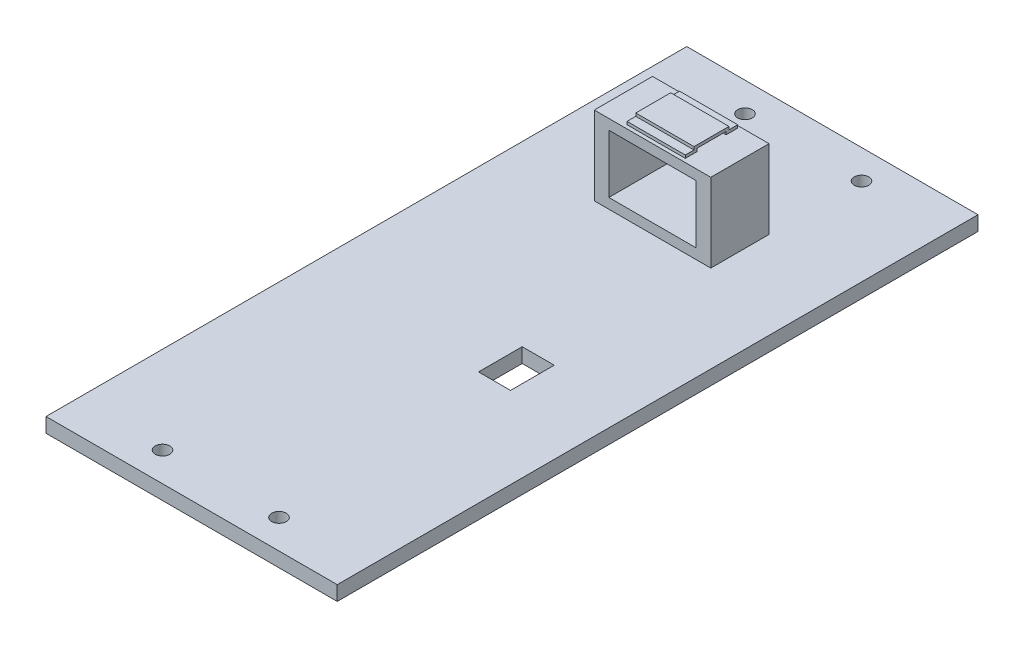
ISO-10303-21;
HEADER;
FILE_DESCRIPTION(('STEP AP214'),'2;1');
FILE_NAME('part.step','',(''),(''),'','','');
FILE_SCHEMA(('AUTOMOTIVE_DESIGN { 1 0 10303 214 1 1 1 1 }'));
ENDSEC;
DATA;
#1=APPLICATION_CONTEXT('core data for automotive mechanical design processes');
#2=APPLICATION_PROTOCOL_DEFINITION('international standard','automotive_design',2000,#1);
#3=PRODUCT_CONTEXT('',#1,'mechanical');
#4=PRODUCT('Part','Part','',(#3));
#5=PRODUCT_RELATED_PRODUCT_CATEGORY('part','',(#4));
#6=PRODUCT_DEFINITION_FORMATION('','',#4);
#7=PRODUCT_DEFINITION_CONTEXT('part definition',#1,'design');
#8=PRODUCT_DEFINITION('design','',#6,#7);
#9=PRODUCT_DEFINITION_SHAPE('','',#8);
#10=(LENGTH_UNIT() NAMED_UNIT(*) SI_UNIT(.MILLI.,.METRE.));
#11=(NAMED_UNIT(*) PLANE_ANGLE_UNIT() SI_UNIT($,.RADIAN.));
#12=(NAMED_UNIT(*) SI_UNIT($,.STERADIAN.) SOLID_ANGLE_UNIT());
#13=UNCERTAINTY_MEASURE_WITH_UNIT(LENGTH_MEASURE(1.E-05),#10,'distance_accuracy_value','');
#14=(GEOMETRIC_REPRESENTATION_CONTEXT(3) GLOBAL_UNCERTAINTY_ASSIGNED_CONTEXT((#13)) GLOBAL_UNIT_ASSIGNED_CONTEXT((#10,
#11,#12)) REPRESENTATION_CONTEXT('',''));
#15=CARTESIAN_POINT('',(0.,0.,0.));
#16=DIRECTION('',(0.,0.,1.));
#17=DIRECTION('',(1.,0.,0.));
#18=AXIS2_PLACEMENT_3D('',#15,#16,#17);
#19=CARTESIAN_POINT('',(50.,5.,-110.));
#20=DIRECTION('',(0.,1.,0.));
#21=DIRECTION('',(0.,0.,1.));
#22=AXIS2_PLACEMENT_3D('',#19,#20,#21);
#23=PLANE('',#22);
#24=DIRECTION('',(-1.,0.,0.));
#25=VECTOR('',#24,1.);
#26=CARTESIAN_POINT('',(11.,5.,7.50000000000003));
#27=LINE('',#26,#25);
#28=CARTESIAN_POINT('',(22.,5.,7.50000000000002));
#29=VERTEX_POINT('',#28);
#30=CARTESIAN_POINT('',(11.,5.,7.50000000000003));
#31=VERTEX_POINT('',#30);
#32=EDGE_CURVE('E127',#29,#31,#27,.T.);
#33=ORIENTED_EDGE('',*,*,#32,.F.);
#34=DIRECTION('',(0.,0.,-1.));
#35=VECTOR('',#34,1.);
#36=CARTESIAN_POINT('',(22.,5.,7.50000000000002));
#37=LINE('',#36,#35);
#38=CARTESIAN_POINT('',(22.,5.,22.5));
#39=VERTEX_POINT('',#38);
#40=EDGE_CURVE('E117',#39,#29,#37,.T.);
#41=ORIENTED_EDGE('',*,*,#40,.F.);
#42=DIRECTION('',(1.,0.,0.));
#43=VECTOR('',#42,1.);
#44=CARTESIAN_POINT('',(11.,5.,22.5));
#45=LINE('',#44,#43);
#46=CARTESIAN_POINT('',(11.,5.,22.5));
#47=VERTEX_POINT('',#46);
#48=EDGE_CURVE('E132',#47,#39,#45,.T.);
#49=ORIENTED_EDGE('',*,*,#48,.F.);
#50=DIRECTION('',(0.,0.,1.));
#51=VECTOR('',#50,1.);
#52=CARTESIAN_POINT('',(11.,5.,7.50000000000003));
#53=LINE('',#52,#51);
#54=EDGE_CURVE('E137',#31,#47,#53,.T.);
#55=ORIENTED_EDGE('',*,*,#54,.F.);
#56=EDGE_LOOP('',(#33,#41,#49,#55));
#57=FACE_BOUND('',#56,.T.);
#58=CARTESIAN_POINT('',(-20.,5.,100.));
#59=DIRECTION('',(0.,1.,0.));
#60=DIRECTION('',(0.,0.,1.));
#61=AXIS2_PLACEMENT_3D('',#58,#59,#60);
#62=CIRCLE('',#61,2.5);
#63=CARTESIAN_POINT('',(-20.,5.,102.5));
#64=VERTEX_POINT('',#63);
#65=EDGE_CURVE('E327',#64,#64,#62,.T.);
#66=ORIENTED_EDGE('',*,*,#65,.F.);
#67=EDGE_LOOP('',(#66));
#68=FACE_BOUND('',#67,.T.);
#69=CARTESIAN_POINT('',(20.,5.,-100.));
#70=DIRECTION('',(0.,1.,0.));
#71=DIRECTION('',(0.,0.,1.));
#72=AXIS2_PLACEMENT_3D('',#69,#70,#71);
#73=CIRCLE('',#72,2.5);
#74=CARTESIAN_POINT('',(20.,5.,-97.5));
#75=VERTEX_POINT('',#74);
#76=EDGE_CURVE('E321',#75,#75,#73,.T.);
#77=ORIENTED_EDGE('',*,*,#76,.F.);
#78=EDGE_LOOP('',(#77));
#79=FACE_BOUND('',#78,.T.);
#80=CARTESIAN_POINT('',(20.0000000000001,5.,100.));
#81=DIRECTION('',(0.,1.,0.));
#82=DIRECTION('',(0.,0.,1.));
#83=AXIS2_PLACEMENT_3D('',#80,#81,#82);
#84=CIRCLE('',#83,2.5);
#85=CARTESIAN_POINT('',(20.0000000000001,5.,102.5));
#86=VERTEX_POINT('',#85);
#87=EDGE_CURVE('E317',#86,#86,#84,.T.);
#88=ORIENTED_EDGE('',*,*,#87,.F.);
#89=EDGE_LOOP('',(#88));
#90=FACE_BOUND('',#89,.T.);
#91=CARTESIAN_POINT('',(-20.,5.,-100.));
#92=DIRECTION('',(0.,1.,0.));
#93=DIRECTION('',(0.,0.,1.));
#94=AXIS2_PLACEMENT_3D('',#91,#92,#93);
#95=CIRCLE('',#94,2.5);
#96=CARTESIAN_POINT('',(-20.,5.,-97.5));
#97=VERTEX_POINT('',#96);
#98=EDGE_CURVE('E336',#97,#97,#95,.T.);
#99=ORIENTED_EDGE('',*,*,#98,.F.);
#100=EDGE_LOOP('',(#99));
#101=FACE_BOUND('',#100,.T.);
#102=DIRECTION('',(0.,0.,-1.));
#103=VECTOR('',#102,1.);
#104=CARTESIAN_POINT('',(50.,5.,110.));
#105=LINE('',#104,#103);
#106=CARTESIAN_POINT('',(50.,5.,110.));
#107=VERTEX_POINT('',#106);
#108=CARTESIAN_POINT('',(50.,5.,-110.));
#109=VERTEX_POINT('',#108);
#110=EDGE_CURVE('E342',#107,#109,#105,.T.);
#111=ORIENTED_EDGE('',*,*,#110,.T.);
#112=DIRECTION('',(-1.,0.,0.));
#113=VECTOR('',#112,1.);
#114=CARTESIAN_POINT('',(-50.,5.,-110.));
#115=LINE('',#114,#113);
#116=CARTESIAN_POINT('',(-50.,5.,-110.));
#117=VERTEX_POINT('',#116);
#118=EDGE_CURVE('E346',#109,#117,#115,.T.);
#119=ORIENTED_EDGE('',*,*,#118,.T.);
#120=DIRECTION('',(0.,0.,1.));
#121=VECTOR('',#120,1.);
#122=CARTESIAN_POINT('',(-50.,5.,110.));
#123=LINE('',#122,#121);
#124=CARTESIAN_POINT('',(-50.,5.,110.));
#125=VERTEX_POINT('',#124);
#126=EDGE_CURVE('E348',#117,#125,#123,.T.);
#127=ORIENTED_EDGE('',*,*,#126,.T.);
#128=DIRECTION('',(1.,0.,0.));
#129=VECTOR('',#128,1.);
#130=CARTESIAN_POINT('',(-50.,5.,110.));
#131=LINE('',#130,#129);
#132=EDGE_CURVE('E350',#125,#107,#131,.T.);
#133=ORIENTED_EDGE('',*,*,#132,.T.);
#134=EDGE_LOOP('',(#111,#119,#127,#133));
#135=FACE_BOUND('',#134,.T.);
#136=ADVANCED_FACE('F53',(#57,#68,#79,#90,#101,#135),#23,.T.);
#137=CARTESIAN_POINT('',(50.,5.,110.));
#138=DIRECTION('',(-1.,0.,0.));
#139=DIRECTION('',(0.,0.,1.));
#140=AXIS2_PLACEMENT_3D('',#137,#138,#139);
#141=PLANE('',#140);
#142=DIRECTION('',(0.,0.,-1.));
#143=VECTOR('',#142,1.);
#144=CARTESIAN_POINT('',(50.,0.,110.));
#145=LINE('',#144,#143);
#146=CARTESIAN_POINT('',(50.,0.,110.));
#147=VERTEX_POINT('',#146);
#148=CARTESIAN_POINT('',(50.,0.,-110.));
#149=VERTEX_POINT('',#148);
#150=EDGE_CURVE('E339',#147,#149,#145,.T.);
#151=ORIENTED_EDGE('',*,*,#150,.T.);
#152=DIRECTION('',(0.,-1.,0.));
#153=VECTOR('',#152,1.);
#154=CARTESIAN_POINT('',(50.,5.,-110.));
#155=LINE('',#154,#153);
#156=EDGE_CURVE('E367',#109,#149,#155,.T.);
#157=ORIENTED_EDGE('',*,*,#156,.F.);
#158=ORIENTED_EDGE('',*,*,#110,.F.);
#159=DIRECTION('',(0.,-1.,0.));
#160=VECTOR('',#159,1.);
#161=CARTESIAN_POINT('',(50.,5.,110.));
#162=LINE('',#161,#160);
#163=EDGE_CURVE('E352',#107,#147,#162,.T.);
#164=ORIENTED_EDGE('',*,*,#163,.T.);
#165=EDGE_LOOP('',(#151,#157,#158,#164));
#166=FACE_BOUND('',#165,.T.);
#167=ADVANCED_FACE('F161',(#166),#141,.F.);
#168=CARTESIAN_POINT('',(-50.,5.,-110.));
#169=DIRECTION('',(0.,0.,1.));
#170=DIRECTION('',(1.,0.,0.));
#171=AXIS2_PLACEMENT_3D('',#168,#169,#170);
#172=PLANE('',#171);
#173=DIRECTION('',(-1.,0.,0.));
#174=VECTOR('',#173,1.);
#175=CARTESIAN_POINT('',(-50.,0.,-110.));
#176=LINE('',#175,#174);
#177=CARTESIAN_POINT('',(-50.,0.,-110.));
#178=VERTEX_POINT('',#177);
#179=EDGE_CURVE('E354',#149,#178,#176,.T.);
#180=ORIENTED_EDGE('',*,*,#179,.T.);
#181=DIRECTION('',(0.,-1.,0.));
#182=VECTOR('',#181,1.);
#183=CARTESIAN_POINT('',(-50.,5.,-110.));
#184=LINE('',#183,#182);
#185=EDGE_CURVE('E364',#117,#178,#184,.T.);
#186=ORIENTED_EDGE('',*,*,#185,.F.);
#187=ORIENTED_EDGE('',*,*,#118,.F.);
#188=ORIENTED_EDGE('',*,*,#156,.T.);
#189=EDGE_LOOP('',(#180,#186,#187,#188));
#190=FACE_BOUND('',#189,.T.);
#191=ADVANCED_FACE('F163',(#190),#172,.F.);
#192=CARTESIAN_POINT('',(-50.,5.,110.));
#193=DIRECTION('',(1.,0.,0.));
#194=DIRECTION('',(0.,0.,-1.));
#195=AXIS2_PLACEMENT_3D('',#192,#193,#194);
#196=PLANE('',#195);
#197=DIRECTION('',(0.,0.,1.));
#198=VECTOR('',#197,1.);
#199=CARTESIAN_POINT('',(-50.,0.,110.));
#200=LINE('',#199,#198);
#201=CARTESIAN_POINT('',(-50.,0.,110.));
#202=VERTEX_POINT('',#201);
#203=EDGE_CURVE('E356',#178,#202,#200,.T.);
#204=ORIENTED_EDGE('',*,*,#203,.T.);
#205=DIRECTION('',(0.,-1.,0.));
#206=VECTOR('',#205,1.);
#207=CARTESIAN_POINT('',(-50.,5.,110.));
#208=LINE('',#207,#206);
#209=EDGE_CURVE('E361',#125,#202,#208,.T.);
#210=ORIENTED_EDGE('',*,*,#209,.F.);
#211=ORIENTED_EDGE('',*,*,#126,.F.);
#212=ORIENTED_EDGE('',*,*,#185,.T.);
#213=EDGE_LOOP('',(#204,#210,#211,#212));
#214=FACE_BOUND('',#213,.T.);
#215=ADVANCED_FACE('F170',(#214),#196,.F.);
#216=CARTESIAN_POINT('',(-50.,5.,110.));
#217=DIRECTION('',(0.,0.,-1.));
#218=DIRECTION('',(-1.,0.,0.));
#219=AXIS2_PLACEMENT_3D('',#216,#217,#218);
#220=PLANE('',#219);
#221=DIRECTION('',(1.,0.,0.));
#222=VECTOR('',#221,1.);
#223=CARTESIAN_POINT('',(-50.,0.,110.));
#224=LINE('',#223,#222);
#225=EDGE_CURVE('E345',#202,#147,#224,.T.);
#226=ORIENTED_EDGE('',*,*,#225,.T.);
#227=ORIENTED_EDGE('',*,*,#163,.F.);
#228=ORIENTED_EDGE('',*,*,#132,.F.);
#229=ORIENTED_EDGE('',*,*,#209,.T.);
#230=EDGE_LOOP('',(#226,#227,#228,#229));
#231=FACE_BOUND('',#230,.T.);
#232=ADVANCED_FACE('F177',(#231),#220,.F.);
#233=CARTESIAN_POINT('',(0.,0.,0.));
#234=DIRECTION('',(0.,-1.,0.));
#235=DIRECTION('',(0.,0.,-1.));
#236=AXIS2_PLACEMENT_3D('',#233,#234,#235);
#237=PLANE('',#236);
#238=DIRECTION('',(0.,0.,-1.));
#239=VECTOR('',#238,1.);
#240=CARTESIAN_POINT('',(22.,0.,7.50000000000002));
#241=LINE('',#240,#239);
#242=CARTESIAN_POINT('',(22.,0.,22.5));
#243=VERTEX_POINT('',#242);
#244=CARTESIAN_POINT('',(22.,0.,7.50000000000002));
#245=VERTEX_POINT('',#244);
#246=EDGE_CURVE('E126',#243,#245,#241,.T.);
#247=ORIENTED_EDGE('',*,*,#246,.T.);
#248=DIRECTION('',(-1.,0.,0.));
#249=VECTOR('',#248,1.);
#250=CARTESIAN_POINT('',(11.,0.,7.50000000000003));
#251=LINE('',#250,#249);
#252=CARTESIAN_POINT('',(11.,0.,7.50000000000003));
#253=VERTEX_POINT('',#252);
#254=EDGE_CURVE('E67',#245,#253,#251,.T.);
#255=ORIENTED_EDGE('',*,*,#254,.T.);
#256=DIRECTION('',(0.,0.,1.));
#257=VECTOR('',#256,1.);
#258=CARTESIAN_POINT('',(11.,0.,7.50000000000003));
#259=LINE('',#258,#257);
#260=CARTESIAN_POINT('',(11.,0.,22.5));
#261=VERTEX_POINT('',#260);
#262=EDGE_CURVE('E12',#253,#261,#259,.T.);
#263=ORIENTED_EDGE('',*,*,#262,.T.);
#264=DIRECTION('',(1.,0.,0.));
#265=VECTOR('',#264,1.);
#266=CARTESIAN_POINT('',(11.,0.,22.5));
#267=LINE('',#266,#265);
#268=EDGE_CURVE('E60',#261,#243,#267,.T.);
#269=ORIENTED_EDGE('',*,*,#268,.T.);
#270=EDGE_LOOP('',(#247,#255,#263,#269));
#271=FACE_BOUND('',#270,.T.);
#272=CARTESIAN_POINT('',(-20.,0.,100.));
#273=DIRECTION('',(0.,-1.,0.));
#274=DIRECTION('',(0.,0.,-1.));
#275=AXIS2_PLACEMENT_3D('',#272,#273,#274);
#276=CIRCLE('',#275,2.5);
#277=CARTESIAN_POINT('',(-20.,0.,97.5));
#278=VERTEX_POINT('',#277);
#279=EDGE_CURVE('E324',#278,#278,#276,.F.);
#280=ORIENTED_EDGE('',*,*,#279,.T.);
#281=EDGE_LOOP('',(#280));
#282=FACE_BOUND('',#281,.T.);
#283=CARTESIAN_POINT('',(20.,0.,-100.));
#284=DIRECTION('',(0.,-1.,0.));
#285=DIRECTION('',(0.,0.,-1.));
#286=AXIS2_PLACEMENT_3D('',#283,#284,#285);
#287=CIRCLE('',#286,2.5);
#288=CARTESIAN_POINT('',(20.,0.,-102.5));
#289=VERTEX_POINT('',#288);
#290=EDGE_CURVE('E331',#289,#289,#287,.F.);
#291=ORIENTED_EDGE('',*,*,#290,.T.);
#292=EDGE_LOOP('',(#291));
#293=FACE_BOUND('',#292,.T.);
#294=CARTESIAN_POINT('',(20.0000000000001,0.,100.));
#295=DIRECTION('',(0.,-1.,0.));
#296=DIRECTION('',(0.,0.,-1.));
#297=AXIS2_PLACEMENT_3D('',#294,#295,#296);
#298=CIRCLE('',#297,2.5);
#299=CARTESIAN_POINT('',(20.0000000000001,0.,97.5));
#300=VERTEX_POINT('',#299);
#301=EDGE_CURVE('E314',#300,#300,#298,.F.);
#302=ORIENTED_EDGE('',*,*,#301,.T.);
#303=EDGE_LOOP('',(#302));
#304=FACE_BOUND('',#303,.T.);
#305=CARTESIAN_POINT('',(-20.,0.,-100.));
#306=DIRECTION('',(0.,-1.,0.));
#307=DIRECTION('',(0.,0.,-1.));
#308=AXIS2_PLACEMENT_3D('',#305,#306,#307);
#309=CIRCLE('',#308,2.5);
#310=CARTESIAN_POINT('',(-20.,0.,-102.5));
#311=VERTEX_POINT('',#310);
#312=EDGE_CURVE('E328',#311,#311,#309,.F.);
#313=ORIENTED_EDGE('',*,*,#312,.T.);
#314=EDGE_LOOP('',(#313));
#315=FACE_BOUND('',#314,.T.);
#316=ORIENTED_EDGE('',*,*,#150,.F.);
#317=ORIENTED_EDGE('',*,*,#225,.F.);
#318=ORIENTED_EDGE('',*,*,#203,.F.);
#319=ORIENTED_EDGE('',*,*,#179,.F.);
#320=EDGE_LOOP('',(#316,#317,#318,#319));
#321=FACE_BOUND('',#320,.T.);
#322=ADVANCED_FACE('F143',(#271,#282,#293,#304,#315,#321),#237,.T.);
#323=CARTESIAN_POINT('',(-20.,-0.00100000000000013,-100.));
#324=DIRECTION('',(0.,1.,0.));
#325=DIRECTION('',(0.,0.,1.));
#326=AXIS2_PLACEMENT_3D('',#323,#324,#325);
#327=CYLINDRICAL_SURFACE('',#326,2.5);
#328=ORIENTED_EDGE('',*,*,#312,.F.);
#329=EDGE_LOOP('',(#328));
#330=FACE_BOUND('',#329,.T.);
#331=ORIENTED_EDGE('',*,*,#98,.T.);
#332=EDGE_LOOP('',(#331));
#333=FACE_BOUND('',#332,.T.);
#334=ADVANCED_FACE('F184',(#330,#333),#327,.F.);
#335=CARTESIAN_POINT('',(20.0000000000001,-0.00100000000000013,100.));
#336=DIRECTION('',(0.,1.,0.));
#337=DIRECTION('',(0.,0.,1.));
#338=AXIS2_PLACEMENT_3D('',#335,#336,#337);
#339=CYLINDRICAL_SURFACE('',#338,2.5);
#340=ORIENTED_EDGE('',*,*,#301,.F.);
#341=EDGE_LOOP('',(#340));
#342=FACE_BOUND('',#341,.T.);
#343=ORIENTED_EDGE('',*,*,#87,.T.);
#344=EDGE_LOOP('',(#343));
#345=FACE_BOUND('',#344,.T.);
#346=ADVANCED_FACE('F187',(#342,#345),#339,.F.);
#347=CARTESIAN_POINT('',(20.,-0.00100000000000013,-100.));
#348=DIRECTION('',(0.,1.,0.));
#349=DIRECTION('',(0.,0.,1.));
#350=AXIS2_PLACEMENT_3D('',#347,#348,#349);
#351=CYLINDRICAL_SURFACE('',#350,2.5);
#352=ORIENTED_EDGE('',*,*,#290,.F.);
#353=EDGE_LOOP('',(#352));
#354=FACE_BOUND('',#353,.T.);
#355=ORIENTED_EDGE('',*,*,#76,.T.);
#356=EDGE_LOOP('',(#355));
#357=FACE_BOUND('',#356,.T.);
#358=ADVANCED_FACE('F189',(#354,#357),#351,.F.);
#359=CARTESIAN_POINT('',(-20.,-0.00100000000000013,100.));
#360=DIRECTION('',(0.,1.,0.));
#361=DIRECTION('',(0.,0.,1.));
#362=AXIS2_PLACEMENT_3D('',#359,#360,#361);
#363=CYLINDRICAL_SURFACE('',#362,2.5);
#364=ORIENTED_EDGE('',*,*,#279,.F.);
#365=EDGE_LOOP('',(#364));
#366=FACE_BOUND('',#365,.T.);
#367=ORIENTED_EDGE('',*,*,#65,.T.);
#368=EDGE_LOOP('',(#367));
#369=FACE_BOUND('',#368,.T.);
#370=ADVANCED_FACE('F159',(#366,#369),#363,.F.);
#371=CARTESIAN_POINT('',(22.,-0.00100000000000013,7.50000000000002));
#372=DIRECTION('',(1.,0.,0.));
#373=DIRECTION('',(0.,0.,-1.));
#374=AXIS2_PLACEMENT_3D('',#371,#372,#373);
#375=PLANE('',#374);
#376=DIRECTION('',(0.,1.,0.));
#377=VECTOR('',#376,1.);
#378=CARTESIAN_POINT('',(22.,-0.00100000000000013,22.5));
#379=LINE('',#378,#377);
#380=EDGE_CURVE('E121',#243,#39,#379,.T.);
#381=ORIENTED_EDGE('',*,*,#380,.T.);
#382=ORIENTED_EDGE('',*,*,#40,.T.);
#383=DIRECTION('',(0.,1.,0.));
#384=VECTOR('',#383,1.);
#385=CARTESIAN_POINT('',(22.,-0.00100000000000013,7.50000000000002));
#386=LINE('',#385,#384);
#387=EDGE_CURVE('E119',#245,#29,#386,.T.);
#388=ORIENTED_EDGE('',*,*,#387,.F.);
#389=ORIENTED_EDGE('',*,*,#246,.F.);
#390=EDGE_LOOP('',(#381,#382,#388,#389));
#391=FACE_BOUND('',#390,.T.);
#392=ADVANCED_FACE('F118',(#391),#375,.F.);
#393=CARTESIAN_POINT('',(11.,-0.00100000000000013,22.5));
#394=DIRECTION('',(0.,0.,1.));
#395=DIRECTION('',(1.,0.,0.));
#396=AXIS2_PLACEMENT_3D('',#393,#394,#395);
#397=PLANE('',#396);
#398=DIRECTION('',(0.,1.,0.));
#399=VECTOR('',#398,1.);
#400=CARTESIAN_POINT('',(11.,-0.00100000000000013,22.5));
#401=LINE('',#400,#399);
#402=EDGE_CURVE('E148',#261,#47,#401,.T.);
#403=ORIENTED_EDGE('',*,*,#402,.T.);
#404=ORIENTED_EDGE('',*,*,#48,.T.);
#405=ORIENTED_EDGE('',*,*,#380,.F.);
#406=ORIENTED_EDGE('',*,*,#268,.F.);
#407=EDGE_LOOP('',(#403,#404,#405,#406));
#408=FACE_BOUND('',#407,.T.);
#409=ADVANCED_FACE('F152',(#408),#397,.F.);
#410=CARTESIAN_POINT('',(11.,-0.00100000000000013,7.50000000000003));
#411=DIRECTION('',(-1.,0.,0.));
#412=DIRECTION('',(0.,0.,1.));
#413=AXIS2_PLACEMENT_3D('',#410,#411,#412);
#414=PLANE('',#413);
#415=DIRECTION('',(0.,1.,0.));
#416=VECTOR('',#415,1.);
#417=CARTESIAN_POINT('',(11.,-0.00100000000000013,7.50000000000003));
#418=LINE('',#417,#416);
#419=EDGE_CURVE('E133',#253,#31,#418,.T.);
#420=ORIENTED_EDGE('',*,*,#419,.T.);
#421=ORIENTED_EDGE('',*,*,#54,.T.);
#422=ORIENTED_EDGE('',*,*,#402,.F.);
#423=ORIENTED_EDGE('',*,*,#262,.F.);
#424=EDGE_LOOP('',(#420,#421,#422,#423));
#425=FACE_BOUND('',#424,.T.);
#426=ADVANCED_FACE('F147',(#425),#414,.F.);
#427=CARTESIAN_POINT('',(11.,-0.00100000000000013,7.50000000000003));
#428=DIRECTION('',(0.,0.,-1.));
#429=DIRECTION('',(-1.,0.,0.));
#430=AXIS2_PLACEMENT_3D('',#427,#428,#429);
#431=PLANE('',#430);
#432=ORIENTED_EDGE('',*,*,#387,.T.);
#433=ORIENTED_EDGE('',*,*,#32,.T.);
#434=ORIENTED_EDGE('',*,*,#419,.F.);
#435=ORIENTED_EDGE('',*,*,#254,.F.);
#436=EDGE_LOOP('',(#432,#433,#434,#435));
#437=FACE_BOUND('',#436,.T.);
#438=ADVANCED_FACE('F130',(#437),#431,.F.);
#439=CLOSED_SHELL('',(#136,#167,#191,#215,#232,#322,#334,#346,#358,#370,#392,#409,#426,#438));
#440=MANIFOLD_SOLID_BREP('B2',#439);
#441=CARTESIAN_POINT('',(50.,5.,-110.));
#442=DIRECTION('',(0.,1.,0.));
#443=DIRECTION('',(0.,0.,1.));
#444=AXIS2_PLACEMENT_3D('',#441,#442,#443);
#445=PLANE('',#444);
#446=DIRECTION('',(-1.,0.,0.));
#447=VECTOR('',#446,1.);
#448=CARTESIAN_POINT('',(20.,5.00000000000003,-48.25));
#449=LINE('',#448,#447);
#450=CARTESIAN_POINT('',(20.,5.,-48.25));
#451=VERTEX_POINT('',#450);
#452=CARTESIAN_POINT('',(-20.,5.00000000000003,-48.25));
#453=VERTEX_POINT('',#452);
#454=EDGE_CURVE('E401',#451,#453,#449,.T.);
#455=ORIENTED_EDGE('',*,*,#454,.T.);
#456=DIRECTION('',(0.,0.,-1.));
#457=VECTOR('',#456,1.);
#458=CARTESIAN_POINT('',(-20.,5.00000000000002,0.));
#459=LINE('',#458,#457);
#460=CARTESIAN_POINT('',(-20.,5.,-68.25));
#461=VERTEX_POINT('',#460);
#462=EDGE_CURVE('E51',#453,#461,#459,.T.);
#463=ORIENTED_EDGE('',*,*,#462,.T.);
#464=DIRECTION('',(-1.,0.,0.));
#465=VECTOR('',#464,1.);
#466=CARTESIAN_POINT('',(20.,5.00000000000003,-68.25));
#467=LINE('',#466,#465);
#468=CARTESIAN_POINT('',(20.,5.,-68.25));
#469=VERTEX_POINT('',#468);
#470=EDGE_CURVE('E419',#469,#461,#467,.T.);
#471=ORIENTED_EDGE('',*,*,#470,.F.);
#472=DIRECTION('',(0.,0.,-1.));
#473=VECTOR('',#472,1.);
#474=CARTESIAN_POINT('',(20.,5.00000000000002,0.));
#475=LINE('',#474,#473);
#476=EDGE_CURVE('E672',#451,#469,#475,.T.);
#477=ORIENTED_EDGE('',*,*,#476,.F.);
#478=EDGE_LOOP('',(#455,#463,#471,#477));
#479=FACE_BOUND('',#478,.T.);
#480=ADVANCED_FACE('F398',(#479),#445,.F.);
#481=CARTESIAN_POINT('',(10.,33.,-52.5));
#482=DIRECTION('',(0.,-1.,0.));
#483=DIRECTION('',(0.,0.,-1.));
#484=AXIS2_PLACEMENT_3D('',#481,#482,#483);
#485=PLANE('',#484);
#486=DIRECTION('',(0.,0.,1.));
#487=VECTOR('',#486,1.);
#488=CARTESIAN_POINT('',(-10.,33.,-52.5));
#489=LINE('',#488,#487);
#490=CARTESIAN_POINT('',(-10.,33.,-52.5));
#491=VERTEX_POINT('',#490);
#492=CARTESIAN_POINT('',(-10.,33.,-49.5));
#493=VERTEX_POINT('',#492);
#494=EDGE_CURVE('E582',#491,#493,#489,.T.);
#495=ORIENTED_EDGE('',*,*,#494,.T.);
#496=DIRECTION('',(-1.,0.,0.));
#497=VECTOR('',#496,1.);
#498=CARTESIAN_POINT('',(10.,33.,-49.5));
#499=LINE('',#498,#497);
#500=CARTESIAN_POINT('',(10.,33.,-49.5));
#501=VERTEX_POINT('',#500);
#502=EDGE_CURVE('E609',#501,#493,#499,.T.);
#503=ORIENTED_EDGE('',*,*,#502,.F.);
#504=DIRECTION('',(0.,0.,1.));
#505=VECTOR('',#504,1.);
#506=CARTESIAN_POINT('',(10.,33.,-52.5));
#507=LINE('',#506,#505);
#508=CARTESIAN_POINT('',(10.,33.,-52.5));
#509=VERTEX_POINT('',#508);
#510=EDGE_CURVE('E607',#509,#501,#507,.T.);
#511=ORIENTED_EDGE('',*,*,#510,.F.);
#512=DIRECTION('',(-1.,0.,0.));
#513=VECTOR('',#512,1.);
#514=CARTESIAN_POINT('',(10.,33.,-52.5));
#515=LINE('',#514,#513);
#516=EDGE_CURVE('E637',#509,#491,#515,.T.);
#517=ORIENTED_EDGE('',*,*,#516,.T.);
#518=EDGE_LOOP('',(#495,#503,#511,#517));
#519=FACE_BOUND('',#518,.T.);
#520=ADVANCED_FACE('F711',(#519),#485,.F.);
#521=CARTESIAN_POINT('',(10.,34.,-52.5));
#522=DIRECTION('',(0.,0.,-1.));
#523=DIRECTION('',(0.,1.,0.));
#524=AXIS2_PLACEMENT_3D('',#521,#522,#523);
#525=PLANE('',#524);
#526=DIRECTION('',(0.,-1.,0.));
#527=VECTOR('',#526,1.);
#528=CARTESIAN_POINT('',(-10.,34.,-52.5));
#529=LINE('',#528,#527);
#530=CARTESIAN_POINT('',(-10.,34.,-52.5));
#531=VERTEX_POINT('',#530);
#532=EDGE_CURVE('E632',#531,#491,#529,.T.);
#533=ORIENTED_EDGE('',*,*,#532,.T.);
#534=ORIENTED_EDGE('',*,*,#516,.F.);
#535=DIRECTION('',(0.,-1.,0.));
#536=VECTOR('',#535,1.);
#537=CARTESIAN_POINT('',(10.,34.,-52.5));
#538=LINE('',#537,#536);
#539=CARTESIAN_POINT('',(10.,34.,-52.5));
#540=VERTEX_POINT('',#539);
#541=EDGE_CURVE('E605',#540,#509,#538,.T.);
#542=ORIENTED_EDGE('',*,*,#541,.F.);
#543=DIRECTION('',(-1.,0.,0.));
#544=VECTOR('',#543,1.);
#545=CARTESIAN_POINT('',(10.,34.,-52.5));
#546=LINE('',#545,#544);
#547=EDGE_CURVE('E640',#540,#531,#546,.T.);
#548=ORIENTED_EDGE('',*,*,#547,.T.);
#549=EDGE_LOOP('',(#533,#534,#542,#548));
#550=FACE_BOUND('',#549,.T.);
#551=ADVANCED_FACE('F715',(#550),#525,.F.);
#552=CARTESIAN_POINT('',(10.,34.,-64.5));
#553=DIRECTION('',(0.,-1.,0.));
#554=DIRECTION('',(0.,0.,-1.));
#555=AXIS2_PLACEMENT_3D('',#552,#553,#554);
#556=PLANE('',#555);
#557=DIRECTION('',(0.,0.,1.));
#558=VECTOR('',#557,1.);
#559=CARTESIAN_POINT('',(-10.,34.,-64.5));
#560=LINE('',#559,#558);
#561=CARTESIAN_POINT('',(-10.,34.,-64.5));
#562=VERTEX_POINT('',#561);
#563=EDGE_CURVE('E630',#562,#531,#560,.T.);
#564=ORIENTED_EDGE('',*,*,#563,.T.);
#565=ORIENTED_EDGE('',*,*,#547,.F.);
#566=DIRECTION('',(0.,0.,1.));
#567=VECTOR('',#566,1.);
#568=CARTESIAN_POINT('',(10.,34.,-64.5));
#569=LINE('',#568,#567);
#570=CARTESIAN_POINT('',(10.,34.,-64.5));
#571=VERTEX_POINT('',#570);
#572=EDGE_CURVE('E603',#571,#540,#569,.T.);
#573=ORIENTED_EDGE('',*,*,#572,.F.);
#574=DIRECTION('',(-1.,0.,0.));
#575=VECTOR('',#574,1.);
#576=CARTESIAN_POINT('',(10.,34.,-64.5));
#577=LINE('',#576,#575);
#578=EDGE_CURVE('E643',#571,#562,#577,.T.);
#579=ORIENTED_EDGE('',*,*,#578,.T.);
#580=EDGE_LOOP('',(#564,#565,#573,#579));
#581=FACE_BOUND('',#580,.T.);
#582=ADVANCED_FACE('F721',(#581),#556,.F.);
#583=CARTESIAN_POINT('',(10.,33.,-64.5));
#584=DIRECTION('',(0.,0.,1.));
#585=DIRECTION('',(1.,0.,0.));
#586=AXIS2_PLACEMENT_3D('',#583,#584,#585);
#587=PLANE('',#586);
#588=DIRECTION('',(0.,1.,0.));
#589=VECTOR('',#588,1.);
#590=CARTESIAN_POINT('',(-10.,33.,-64.5));
#591=LINE('',#590,#589);
#592=CARTESIAN_POINT('',(-10.,33.,-64.5));
#593=VERTEX_POINT('',#592);
#594=EDGE_CURVE('E628',#593,#562,#591,.T.);
#595=ORIENTED_EDGE('',*,*,#594,.T.);
#596=ORIENTED_EDGE('',*,*,#578,.F.);
#597=DIRECTION('',(0.,1.,0.));
#598=VECTOR('',#597,1.);
#599=CARTESIAN_POINT('',(10.,33.,-64.5));
#600=LINE('',#599,#598);
#601=CARTESIAN_POINT('',(10.,33.,-64.5));
#602=VERTEX_POINT('',#601);
#603=EDGE_CURVE('E601',#602,#571,#600,.T.);
#604=ORIENTED_EDGE('',*,*,#603,.F.);
#605=DIRECTION('',(-1.,0.,0.));
#606=VECTOR('',#605,1.);
#607=CARTESIAN_POINT('',(10.,33.,-64.5));
#608=LINE('',#607,#606);
#609=EDGE_CURVE('E646',#602,#593,#608,.T.);
#610=ORIENTED_EDGE('',*,*,#609,.T.);
#611=EDGE_LOOP('',(#595,#596,#604,#610));
#612=FACE_BOUND('',#611,.T.);
#613=ADVANCED_FACE('F730',(#612),#587,.F.);
#614=CARTESIAN_POINT('',(10.,33.,-67.5));
#615=DIRECTION('',(0.,-1.,0.));
#616=DIRECTION('',(0.,0.,-1.));
#617=AXIS2_PLACEMENT_3D('',#614,#615,#616);
#618=PLANE('',#617);
#619=DIRECTION('',(0.,0.,1.));
#620=VECTOR('',#619,1.);
#621=CARTESIAN_POINT('',(-10.,33.,-67.5));
#622=LINE('',#621,#620);
#623=CARTESIAN_POINT('',(-10.,33.,-67.5));
#624=VERTEX_POINT('',#623);
#625=EDGE_CURVE('E626',#624,#593,#622,.T.);
#626=ORIENTED_EDGE('',*,*,#625,.T.);
#627=ORIENTED_EDGE('',*,*,#609,.F.);
#628=DIRECTION('',(0.,0.,1.));
#629=VECTOR('',#628,1.);
#630=CARTESIAN_POINT('',(10.,33.,-67.5));
#631=LINE('',#630,#629);
#632=CARTESIAN_POINT('',(10.,33.,-67.5));
#633=VERTEX_POINT('',#632);
#634=EDGE_CURVE('E599',#633,#602,#631,.T.);
#635=ORIENTED_EDGE('',*,*,#634,.F.);
#636=DIRECTION('',(-1.,0.,0.));
#637=VECTOR('',#636,1.);
#638=CARTESIAN_POINT('',(10.,33.,-67.5));
#639=LINE('',#638,#637);
#640=EDGE_CURVE('E649',#633,#624,#639,.T.);
#641=ORIENTED_EDGE('',*,*,#640,.T.);
#642=EDGE_LOOP('',(#626,#627,#635,#641));
#643=FACE_BOUND('',#642,.T.);
#644=ADVANCED_FACE('F734',(#643),#618,.F.);
#645=CARTESIAN_POINT('',(10.,33.,-64.5));
#646=DIRECTION('',(0.,-1.,0.));
#647=DIRECTION('',(0.,0.,-1.));
#648=AXIS2_PLACEMENT_3D('',#645,#646,#647);
#649=PLANE('',#648);
#650=DIRECTION('',(0.,0.,-1.));
#651=VECTOR('',#650,1.);
#652=CARTESIAN_POINT('',(-10.,33.,-64.5));
#653=LINE('',#652,#651);
#654=CARTESIAN_POINT('',(-10.,33.,-63.5));
#655=VERTEX_POINT('',#654);
#656=CARTESIAN_POINT('',(-10.,33.,-53.5));
#657=VERTEX_POINT('',#656);
#658=EDGE_CURVE('E616',#655,#657,#653,.F.);
#659=ORIENTED_EDGE('',*,*,#658,.F.);
#660=DIRECTION('',(-1.,0.,0.));
#661=VECTOR('',#660,1.);
#662=CARTESIAN_POINT('',(10.,33.,-63.5));
#663=LINE('',#662,#661);
#664=CARTESIAN_POINT('',(10.,33.,-63.5));
#665=VERTEX_POINT('',#664);
#666=EDGE_CURVE('E658',#665,#655,#663,.T.);
#667=ORIENTED_EDGE('',*,*,#666,.F.);
#668=DIRECTION('',(0.,0.,-1.));
#669=VECTOR('',#668,1.);
#670=CARTESIAN_POINT('',(10.,33.,-64.5));
#671=LINE('',#670,#669);
#672=CARTESIAN_POINT('',(10.,33.,-53.5));
#673=VERTEX_POINT('',#672);
#674=EDGE_CURVE('E588',#665,#673,#671,.F.);
#675=ORIENTED_EDGE('',*,*,#674,.T.);
#676=DIRECTION('',(-1.,0.,0.));
#677=VECTOR('',#676,1.);
#678=CARTESIAN_POINT('',(10.,33.,-53.5));
#679=LINE('',#678,#677);
#680=EDGE_CURVE('E660',#673,#657,#679,.T.);
#681=ORIENTED_EDGE('',*,*,#680,.T.);
#682=EDGE_LOOP('',(#659,#667,#675,#681));
#683=FACE_BOUND('',#682,.T.);
#684=ADVANCED_FACE('F738',(#683),#649,.T.);
#685=CARTESIAN_POINT('',(10.,34.,-53.5));
#686=DIRECTION('',(0.,0.,-1.));
#687=DIRECTION('',(0.,1.,0.));
#688=AXIS2_PLACEMENT_3D('',#685,#686,#687);
#689=PLANE('',#688);
#690=DIRECTION('',(0.,-1.,0.));
#691=VECTOR('',#690,1.);
#692=CARTESIAN_POINT('',(-10.,34.,-53.5));
#693=LINE('',#692,#691);
#694=CARTESIAN_POINT('',(-10.,32.,-53.5));
#695=VERTEX_POINT('',#694);
#696=EDGE_CURVE('E614',#657,#695,#693,.T.);
#697=ORIENTED_EDGE('',*,*,#696,.F.);
#698=ORIENTED_EDGE('',*,*,#680,.F.);
#699=DIRECTION('',(0.,-1.,0.));
#700=VECTOR('',#699,1.);
#701=CARTESIAN_POINT('',(10.,34.,-53.5));
#702=LINE('',#701,#700);
#703=CARTESIAN_POINT('',(10.,32.,-53.5));
#704=VERTEX_POINT('',#703);
#705=EDGE_CURVE('E585',#673,#704,#702,.T.);
#706=ORIENTED_EDGE('',*,*,#705,.T.);
#707=DIRECTION('',(-1.,0.,0.));
#708=VECTOR('',#707,1.);
#709=CARTESIAN_POINT('',(10.,32.,-53.5));
#710=LINE('',#709,#708);
#711=EDGE_CURVE('E662',#704,#695,#710,.T.);
#712=ORIENTED_EDGE('',*,*,#711,.T.);
#713=EDGE_LOOP('',(#697,#698,#706,#712));
#714=FACE_BOUND('',#713,.T.);
#715=ADVANCED_FACE('F752',(#714),#689,.T.);
#716=CARTESIAN_POINT('',(10.,33.,-49.5));
#717=DIRECTION('',(0.,0.,-1.));
#718=DIRECTION('',(-1.,0.,0.));
#719=AXIS2_PLACEMENT_3D('',#716,#717,#718);
#720=PLANE('',#719);
#721=DIRECTION('',(0.,-1.,0.));
#722=VECTOR('',#721,1.);
#723=CARTESIAN_POINT('',(-10.,33.,-49.5));
#724=LINE('',#723,#722);
#725=CARTESIAN_POINT('',(-10.,32.,-49.5));
#726=VERTEX_POINT('',#725);
#727=EDGE_CURVE('E555',#493,#726,#724,.T.);
#728=ORIENTED_EDGE('',*,*,#727,.T.);
#729=DIRECTION('',(-1.,0.,0.));
#730=VECTOR('',#729,1.);
#731=CARTESIAN_POINT('',(10.,32.,-49.5));
#732=LINE('',#731,#730);
#733=CARTESIAN_POINT('',(10.,32.,-49.5));
#734=VERTEX_POINT('',#733);
#735=EDGE_CURVE('E665',#734,#726,#732,.T.);
#736=ORIENTED_EDGE('',*,*,#735,.F.);
#737=DIRECTION('',(0.,-1.,0.));
#738=VECTOR('',#737,1.);
#739=CARTESIAN_POINT('',(10.,33.,-49.5));
#740=LINE('',#739,#738);
#741=EDGE_CURVE('E579',#501,#734,#740,.T.);
#742=ORIENTED_EDGE('',*,*,#741,.F.);
#743=ORIENTED_EDGE('',*,*,#502,.T.);
#744=EDGE_LOOP('',(#728,#736,#742,#743));
#745=FACE_BOUND('',#744,.T.);
#746=ADVANCED_FACE('F743',(#745),#720,.F.);
#747=CARTESIAN_POINT('',(10.,32.,-67.5));
#748=DIRECTION('',(0.,0.,1.));
#749=DIRECTION('',(1.,0.,0.));
#750=AXIS2_PLACEMENT_3D('',#747,#748,#749);
#751=PLANE('',#750);
#752=DIRECTION('',(0.,1.,0.));
#753=VECTOR('',#752,1.);
#754=CARTESIAN_POINT('',(-10.,32.,-67.5));
#755=LINE('',#754,#753);
#756=CARTESIAN_POINT('',(-10.,32.,-67.5));
#757=VERTEX_POINT('',#756);
#758=EDGE_CURVE('E624',#757,#624,#755,.T.);
#759=ORIENTED_EDGE('',*,*,#758,.T.);
#760=ORIENTED_EDGE('',*,*,#640,.F.);
#761=DIRECTION('',(0.,1.,0.));
#762=VECTOR('',#761,1.);
#763=CARTESIAN_POINT('',(10.,32.,-67.5));
#764=LINE('',#763,#762);
#765=CARTESIAN_POINT('',(10.,32.,-67.5));
#766=VERTEX_POINT('',#765);
#767=EDGE_CURVE('E597',#766,#633,#764,.T.);
#768=ORIENTED_EDGE('',*,*,#767,.F.);
#769=DIRECTION('',(-1.,0.,0.));
#770=VECTOR('',#769,1.);
#771=CARTESIAN_POINT('',(10.,32.,-67.5));
#772=LINE('',#771,#770);
#773=EDGE_CURVE('E652',#766,#757,#772,.T.);
#774=ORIENTED_EDGE('',*,*,#773,.T.);
#775=EDGE_LOOP('',(#759,#760,#768,#774));
#776=FACE_BOUND('',#775,.T.);
#777=ADVANCED_FACE('F740',(#776),#751,.F.);
#778=CARTESIAN_POINT('',(-10.,0.,0.));
#779=DIRECTION('',(-1.,0.,0.));
#780=DIRECTION('',(0.,0.,1.));
#781=AXIS2_PLACEMENT_3D('',#778,#779,#780);
#782=PLANE('',#781);
#783=ORIENTED_EDGE('',*,*,#727,.F.);
#784=ORIENTED_EDGE('',*,*,#494,.F.);
#785=ORIENTED_EDGE('',*,*,#532,.F.);
#786=ORIENTED_EDGE('',*,*,#563,.F.);
#787=ORIENTED_EDGE('',*,*,#594,.F.);
#788=ORIENTED_EDGE('',*,*,#625,.F.);
#789=ORIENTED_EDGE('',*,*,#758,.F.);
#790=DIRECTION('',(0.,0.,1.));
#791=VECTOR('',#790,1.);
#792=CARTESIAN_POINT('',(-10.,32.,-67.5));
#793=LINE('',#792,#791);
#794=CARTESIAN_POINT('',(-10.,32.,-63.5));
#795=VERTEX_POINT('',#794);
#796=EDGE_CURVE('E622',#757,#795,#793,.T.);
#797=ORIENTED_EDGE('',*,*,#796,.T.);
#798=DIRECTION('',(0.,1.,0.));
#799=VECTOR('',#798,1.);
#800=CARTESIAN_POINT('',(-10.,33.,-63.5));
#801=LINE('',#800,#799);
#802=EDGE_CURVE('E619',#795,#655,#801,.T.);
#803=ORIENTED_EDGE('',*,*,#802,.T.);
#804=ORIENTED_EDGE('',*,*,#658,.T.);
#805=ORIENTED_EDGE('',*,*,#696,.T.);
#806=DIRECTION('',(0.,0.,1.));
#807=VECTOR('',#806,1.);
#808=CARTESIAN_POINT('',(-10.,32.,-52.5));
#809=LINE('',#808,#807);
#810=EDGE_CURVE('E612',#695,#726,#809,.T.);
#811=ORIENTED_EDGE('',*,*,#810,.T.);
#812=EDGE_LOOP('',(#783,#784,#785,#786,#787,#788,#789,#797,#803,#804,#805,#811));
#813=FACE_BOUND('',#812,.T.);
#814=ADVANCED_FACE('F725',(#813),#782,.T.);
#815=CARTESIAN_POINT('',(10.,33.,-63.5));
#816=DIRECTION('',(0.,0.,1.));
#817=DIRECTION('',(1.,0.,0.));
#818=AXIS2_PLACEMENT_3D('',#815,#816,#817);
#819=PLANE('',#818);
#820=ORIENTED_EDGE('',*,*,#802,.F.);
#821=DIRECTION('',(-1.,0.,0.));
#822=VECTOR('',#821,1.);
#823=CARTESIAN_POINT('',(10.,32.,-63.5));
#824=LINE('',#823,#822);
#825=CARTESIAN_POINT('',(10.,32.,-63.5));
#826=VERTEX_POINT('',#825);
#827=EDGE_CURVE('E655',#826,#795,#824,.T.);
#828=ORIENTED_EDGE('',*,*,#827,.F.);
#829=DIRECTION('',(0.,1.,0.));
#830=VECTOR('',#829,1.);
#831=CARTESIAN_POINT('',(10.,33.,-63.5));
#832=LINE('',#831,#830);
#833=EDGE_CURVE('E591',#826,#665,#832,.T.);
#834=ORIENTED_EDGE('',*,*,#833,.T.);
#835=ORIENTED_EDGE('',*,*,#666,.T.);
#836=EDGE_LOOP('',(#820,#828,#834,#835));
#837=FACE_BOUND('',#836,.T.);
#838=ADVANCED_FACE('F745',(#837),#819,.T.);
#839=CARTESIAN_POINT('',(10.,0.,0.));
#840=DIRECTION('',(-1.,0.,0.));
#841=DIRECTION('',(0.,0.,1.));
#842=AXIS2_PLACEMENT_3D('',#839,#840,#841);
#843=PLANE('',#842);
#844=ORIENTED_EDGE('',*,*,#741,.T.);
#845=DIRECTION('',(0.,0.,1.));
#846=VECTOR('',#845,1.);
#847=CARTESIAN_POINT('',(10.,32.,-50.5));
#848=LINE('',#847,#846);
#849=EDGE_CURVE('E581',#704,#734,#848,.T.);
#850=ORIENTED_EDGE('',*,*,#849,.F.);
#851=ORIENTED_EDGE('',*,*,#705,.F.);
#852=ORIENTED_EDGE('',*,*,#674,.F.);
#853=ORIENTED_EDGE('',*,*,#833,.F.);
#854=DIRECTION('',(0.,0.,-1.));
#855=VECTOR('',#854,1.);
#856=CARTESIAN_POINT('',(10.,32.,-67.5));
#857=LINE('',#856,#855);
#858=EDGE_CURVE('E594',#766,#826,#857,.F.);
#859=ORIENTED_EDGE('',*,*,#858,.F.);
#860=ORIENTED_EDGE('',*,*,#767,.T.);
#861=ORIENTED_EDGE('',*,*,#634,.T.);
#862=ORIENTED_EDGE('',*,*,#603,.T.);
#863=ORIENTED_EDGE('',*,*,#572,.T.);
#864=ORIENTED_EDGE('',*,*,#541,.T.);
#865=ORIENTED_EDGE('',*,*,#510,.T.);
#866=EDGE_LOOP('',(#844,#850,#851,#852,#853,#859,#860,#861,#862,#863,#864,#865));
#867=FACE_BOUND('',#866,.T.);
#868=ADVANCED_FACE('F748',(#867),#843,.F.);
#869=CARTESIAN_POINT('',(15.,8.50000000000003,110.001));
#870=DIRECTION('',(1.,0.,0.));
#871=DIRECTION('',(0.,0.,-1.));
#872=AXIS2_PLACEMENT_3D('',#869,#870,#871);
#873=PLANE('',#872);
#874=DIRECTION('',(0.,1.,0.));
#875=VECTOR('',#874,1.);
#876=CARTESIAN_POINT('',(15.,8.50000000000011,-48.25));
#877=LINE('',#876,#875);
#878=CARTESIAN_POINT('',(15.,8.50000000000003,-48.25));
#879=VERTEX_POINT('',#878);
#880=CARTESIAN_POINT('',(15.,28.5,-48.25));
#881=VERTEX_POINT('',#880);
#882=EDGE_CURVE('E565',#879,#881,#877,.T.);
#883=ORIENTED_EDGE('',*,*,#882,.T.);
#884=DIRECTION('',(0.,0.,-1.));
#885=VECTOR('',#884,1.);
#886=CARTESIAN_POINT('',(15.,28.5,110.001));
#887=LINE('',#886,#885);
#888=CARTESIAN_POINT('',(15.,28.5,-68.25));
#889=VERTEX_POINT('',#888);
#890=EDGE_CURVE('E546',#881,#889,#887,.T.);
#891=ORIENTED_EDGE('',*,*,#890,.T.);
#892=DIRECTION('',(0.,-1.,0.));
#893=VECTOR('',#892,1.);
#894=CARTESIAN_POINT('',(15.,8.50000000000003,-68.25));
#895=LINE('',#894,#893);
#896=CARTESIAN_POINT('',(15.,8.50000000000003,-68.25));
#897=VERTEX_POINT('',#896);
#898=EDGE_CURVE('E570',#889,#897,#895,.T.);
#899=ORIENTED_EDGE('',*,*,#898,.T.);
#900=DIRECTION('',(0.,0.,-1.));
#901=VECTOR('',#900,1.);
#902=CARTESIAN_POINT('',(15.,8.50000000000003,110.001));
#903=LINE('',#902,#901);
#904=EDGE_CURVE('E576',#879,#897,#903,.T.);
#905=ORIENTED_EDGE('',*,*,#904,.F.);
#906=EDGE_LOOP('',(#883,#891,#899,#905));
#907=FACE_BOUND('',#906,.T.);
#908=ADVANCED_FACE('F810',(#907),#873,.F.);
#909=CARTESIAN_POINT('',(15.,8.50000000000003,110.001));
#910=DIRECTION('',(0.,-1.,0.));
#911=DIRECTION('',(0.,0.,-1.));
#912=AXIS2_PLACEMENT_3D('',#909,#910,#911);
#913=PLANE('',#912);
#914=DIRECTION('',(1.,0.,0.));
#915=VECTOR('',#914,1.);
#916=CARTESIAN_POINT('',(15.,8.50000000000003,-48.25));
#917=LINE('',#916,#915);
#918=CARTESIAN_POINT('',(-15.,8.50000000000003,-48.25));
#919=VERTEX_POINT('',#918);
#920=EDGE_CURVE('E561',#919,#879,#917,.T.);
#921=ORIENTED_EDGE('',*,*,#920,.T.);
#922=ORIENTED_EDGE('',*,*,#904,.T.);
#923=DIRECTION('',(-1.,0.,0.));
#924=VECTOR('',#923,1.);
#925=CARTESIAN_POINT('',(15.,8.50000000000003,-68.25));
#926=LINE('',#925,#924);
#927=CARTESIAN_POINT('',(-15.,8.50000000000003,-68.25));
#928=VERTEX_POINT('',#927);
#929=EDGE_CURVE('E547',#897,#928,#926,.T.);
#930=ORIENTED_EDGE('',*,*,#929,.T.);
#931=DIRECTION('',(0.,0.,-1.));
#932=VECTOR('',#931,1.);
#933=CARTESIAN_POINT('',(-15.,8.50000000000003,110.001));
#934=LINE('',#933,#932);
#935=EDGE_CURVE('E556',#919,#928,#934,.T.);
#936=ORIENTED_EDGE('',*,*,#935,.F.);
#937=EDGE_LOOP('',(#921,#922,#930,#936));
#938=FACE_BOUND('',#937,.T.);
#939=ADVANCED_FACE('F816',(#938),#913,.F.);
#940=CARTESIAN_POINT('',(-15.,8.50000000000003,110.001));
#941=DIRECTION('',(-1.,0.,0.));
#942=DIRECTION('',(0.,0.,1.));
#943=AXIS2_PLACEMENT_3D('',#940,#941,#942);
#944=PLANE('',#943);
#945=DIRECTION('',(0.,-1.,0.));
#946=VECTOR('',#945,1.);
#947=CARTESIAN_POINT('',(-15.,8.50000000000011,-48.25));
#948=LINE('',#947,#946);
#949=CARTESIAN_POINT('',(-15.,28.5,-48.25));
#950=VERTEX_POINT('',#949);
#951=EDGE_CURVE('E539',#950,#919,#948,.T.);
#952=ORIENTED_EDGE('',*,*,#951,.T.);
#953=ORIENTED_EDGE('',*,*,#935,.T.);
#954=DIRECTION('',(0.,1.,0.));
#955=VECTOR('',#954,1.);
#956=CARTESIAN_POINT('',(-15.,8.50000000000003,-68.25));
#957=LINE('',#956,#955);
#958=CARTESIAN_POINT('',(-15.,28.5,-68.25));
#959=VERTEX_POINT('',#958);
#960=EDGE_CURVE('E542',#928,#959,#957,.T.);
#961=ORIENTED_EDGE('',*,*,#960,.T.);
#962=DIRECTION('',(0.,0.,-1.));
#963=VECTOR('',#962,1.);
#964=CARTESIAN_POINT('',(-15.,28.5,110.001));
#965=LINE('',#964,#963);
#966=EDGE_CURVE('E535',#950,#959,#965,.T.);
#967=ORIENTED_EDGE('',*,*,#966,.F.);
#968=EDGE_LOOP('',(#952,#953,#961,#967));
#969=FACE_BOUND('',#968,.T.);
#970=ADVANCED_FACE('F537',(#969),#944,.F.);
#971=CARTESIAN_POINT('',(15.,28.5,110.001));
#972=DIRECTION('',(0.,1.,0.));
#973=DIRECTION('',(0.,0.,1.));
#974=AXIS2_PLACEMENT_3D('',#971,#972,#973);
#975=PLANE('',#974);
#976=DIRECTION('',(-1.,0.,0.));
#977=VECTOR('',#976,1.);
#978=CARTESIAN_POINT('',(15.,28.5,-48.25));
#979=LINE('',#978,#977);
#980=EDGE_CURVE('E551',#881,#950,#979,.T.);
#981=ORIENTED_EDGE('',*,*,#980,.T.);
#982=ORIENTED_EDGE('',*,*,#966,.T.);
#983=DIRECTION('',(1.,0.,0.));
#984=VECTOR('',#983,1.);
#985=CARTESIAN_POINT('',(15.,28.5,-68.25));
#986=LINE('',#985,#984);
#987=EDGE_CURVE('E563',#959,#889,#986,.T.);
#988=ORIENTED_EDGE('',*,*,#987,.T.);
#989=ORIENTED_EDGE('',*,*,#890,.F.);
#990=EDGE_LOOP('',(#981,#982,#988,#989));
#991=FACE_BOUND('',#990,.T.);
#992=ADVANCED_FACE('F552',(#991),#975,.F.);
#993=CARTESIAN_POINT('',(20.,0.,-68.25));
#994=DIRECTION('',(0.,0.,1.));
#995=DIRECTION('',(1.,0.,0.));
#996=AXIS2_PLACEMENT_3D('',#993,#994,#995);
#997=PLANE('',#996);
#998=ORIENTED_EDGE('',*,*,#987,.F.);
#999=ORIENTED_EDGE('',*,*,#960,.F.);
#1000=ORIENTED_EDGE('',*,*,#929,.F.);
#1001=ORIENTED_EDGE('',*,*,#898,.F.);
#1002=EDGE_LOOP('',(#998,#999,#1000,#1001));
#1003=FACE_BOUND('',#1002,.T.);
#1004=DIRECTION('',(0.,1.,0.));
#1005=VECTOR('',#1004,1.);
#1006=CARTESIAN_POINT('',(-20.,0.,-68.25));
#1007=LINE('',#1006,#1005);
#1008=CARTESIAN_POINT('',(-20.,32.,-68.25));
#1009=VERTEX_POINT('',#1008);
#1010=EDGE_CURVE('E681',#461,#1009,#1007,.T.);
#1011=ORIENTED_EDGE('',*,*,#1010,.T.);
#1012=DIRECTION('',(-1.,0.,0.));
#1013=VECTOR('',#1012,1.);
#1014=CARTESIAN_POINT('',(20.,32.,-68.25));
#1015=LINE('',#1014,#1013);
#1016=CARTESIAN_POINT('',(20.,32.,-68.25));
#1017=VERTEX_POINT('',#1016);
#1018=EDGE_CURVE('E687',#1017,#1009,#1015,.T.);
#1019=ORIENTED_EDGE('',*,*,#1018,.F.);
#1020=DIRECTION('',(0.,1.,0.));
#1021=VECTOR('',#1020,1.);
#1022=CARTESIAN_POINT('',(20.,0.,-68.25));
#1023=LINE('',#1022,#1021);
#1024=EDGE_CURVE('E675',#469,#1017,#1023,.T.);
#1025=ORIENTED_EDGE('',*,*,#1024,.F.);
#1026=ORIENTED_EDGE('',*,*,#470,.T.);
#1027=EDGE_LOOP('',(#1011,#1019,#1025,#1026));
#1028=FACE_BOUND('',#1027,.T.);
#1029=ADVANCED_FACE('F700',(#1003,#1028),#997,.F.);
#1030=CARTESIAN_POINT('',(20.,32.,0.));
#1031=DIRECTION('',(0.,-1.,0.));
#1032=DIRECTION('',(0.,0.,-1.));
#1033=AXIS2_PLACEMENT_3D('',#1030,#1031,#1032);
#1034=PLANE('',#1033);
#1035=ORIENTED_EDGE('',*,*,#858,.T.);
#1036=ORIENTED_EDGE('',*,*,#827,.T.);
#1037=ORIENTED_EDGE('',*,*,#796,.F.);
#1038=ORIENTED_EDGE('',*,*,#773,.F.);
#1039=EDGE_LOOP('',(#1035,#1036,#1037,#1038));
#1040=FACE_BOUND('',#1039,.T.);
#1041=DIRECTION('',(0.,0.,1.));
#1042=VECTOR('',#1041,1.);
#1043=CARTESIAN_POINT('',(-20.,32.,0.));
#1044=LINE('',#1043,#1042);
#1045=CARTESIAN_POINT('',(-20.,32.,-48.25));
#1046=VERTEX_POINT('',#1045);
#1047=EDGE_CURVE('E673',#1009,#1046,#1044,.T.);
#1048=ORIENTED_EDGE('',*,*,#1047,.T.);
#1049=DIRECTION('',(-1.,0.,0.));
#1050=VECTOR('',#1049,1.);
#1051=CARTESIAN_POINT('',(20.,32.,-48.25));
#1052=LINE('',#1051,#1050);
#1053=CARTESIAN_POINT('',(20.,32.,-48.25));
#1054=VERTEX_POINT('',#1053);
#1055=EDGE_CURVE('E679',#1054,#1046,#1052,.T.);
#1056=ORIENTED_EDGE('',*,*,#1055,.F.);
#1057=DIRECTION('',(0.,0.,1.));
#1058=VECTOR('',#1057,1.);
#1059=CARTESIAN_POINT('',(20.,32.,0.));
#1060=LINE('',#1059,#1058);
#1061=EDGE_CURVE('E677',#1017,#1054,#1060,.T.);
#1062=ORIENTED_EDGE('',*,*,#1061,.F.);
#1063=ORIENTED_EDGE('',*,*,#1018,.T.);
#1064=EDGE_LOOP('',(#1048,#1056,#1062,#1063));
#1065=FACE_BOUND('',#1064,.T.);
#1066=ORIENTED_EDGE('',*,*,#849,.T.);
#1067=ORIENTED_EDGE('',*,*,#735,.T.);
#1068=ORIENTED_EDGE('',*,*,#810,.F.);
#1069=ORIENTED_EDGE('',*,*,#711,.F.);
#1070=EDGE_LOOP('',(#1066,#1067,#1068,#1069));
#1071=FACE_BOUND('',#1070,.T.);
#1072=ADVANCED_FACE('F696',(#1040,#1065,#1071),#1034,.F.);
#1073=CARTESIAN_POINT('',(20.,0.,-48.25));
#1074=DIRECTION('',(0.,0.,-1.));
#1075=DIRECTION('',(0.,1.,0.));
#1076=AXIS2_PLACEMENT_3D('',#1073,#1074,#1075);
#1077=PLANE('',#1076);
#1078=ORIENTED_EDGE('',*,*,#920,.F.);
#1079=ORIENTED_EDGE('',*,*,#951,.F.);
#1080=ORIENTED_EDGE('',*,*,#980,.F.);
#1081=ORIENTED_EDGE('',*,*,#882,.F.);
#1082=EDGE_LOOP('',(#1078,#1079,#1080,#1081));
#1083=FACE_BOUND('',#1082,.T.);
#1084=DIRECTION('',(0.,-1.,0.));
#1085=VECTOR('',#1084,1.);
#1086=CARTESIAN_POINT('',(-20.,0.,-48.25));
#1087=LINE('',#1086,#1085);
#1088=EDGE_CURVE('E668',#1046,#453,#1087,.T.);
#1089=ORIENTED_EDGE('',*,*,#1088,.T.);
#1090=ORIENTED_EDGE('',*,*,#454,.F.);
#1091=DIRECTION('',(0.,-1.,0.));
#1092=VECTOR('',#1091,1.);
#1093=CARTESIAN_POINT('',(20.,0.,-48.25));
#1094=LINE('',#1093,#1092);
#1095=EDGE_CURVE('E669',#1054,#451,#1094,.T.);
#1096=ORIENTED_EDGE('',*,*,#1095,.F.);
#1097=ORIENTED_EDGE('',*,*,#1055,.T.);
#1098=EDGE_LOOP('',(#1089,#1090,#1096,#1097));
#1099=FACE_BOUND('',#1098,.T.);
#1100=ADVANCED_FACE('F558',(#1083,#1099),#1077,.F.);
#1101=CARTESIAN_POINT('',(-20.,0.,0.));
#1102=DIRECTION('',(1.,0.,0.));
#1103=DIRECTION('',(0.,0.,-1.));
#1104=AXIS2_PLACEMENT_3D('',#1101,#1102,#1103);
#1105=PLANE('',#1104);
#1106=ORIENTED_EDGE('',*,*,#1088,.F.);
#1107=ORIENTED_EDGE('',*,*,#1047,.F.);
#1108=ORIENTED_EDGE('',*,*,#1010,.F.);
#1109=ORIENTED_EDGE('',*,*,#462,.F.);
#1110=EDGE_LOOP('',(#1106,#1107,#1108,#1109));
#1111=FACE_BOUND('',#1110,.T.);
#1112=ADVANCED_FACE('F694',(#1111),#1105,.F.);
#1113=CARTESIAN_POINT('',(20.,0.,0.));
#1114=DIRECTION('',(1.,0.,0.));
#1115=DIRECTION('',(0.,0.,-1.));
#1116=AXIS2_PLACEMENT_3D('',#1113,#1114,#1115);
#1117=PLANE('',#1116);
#1118=ORIENTED_EDGE('',*,*,#1095,.T.);
#1119=ORIENTED_EDGE('',*,*,#476,.T.);
#1120=ORIENTED_EDGE('',*,*,#1024,.T.);
#1121=ORIENTED_EDGE('',*,*,#1061,.T.);
#1122=EDGE_LOOP('',(#1118,#1119,#1120,#1121));
#1123=FACE_BOUND('',#1122,.T.);
#1124=ADVANCED_FACE('F702',(#1123),#1117,.T.);
#1125=CLOSED_SHELL('',(#480,#520,#551,#582,#613,#644,#684,#715,#746,#777,#814,#838,#868,#908,
#939,#970,#992,#1029,#1072,#1100,#1112,#1124));
#1126=MANIFOLD_SOLID_BREP('B6',#1125);
#1127=ADVANCED_BREP_SHAPE_REPRESENTATION('',(#18,#440,#1126),#14);
#1128=SHAPE_DEFINITION_REPRESENTATION(#9,#1127);
ENDSEC;
END-ISO-10303-21;
